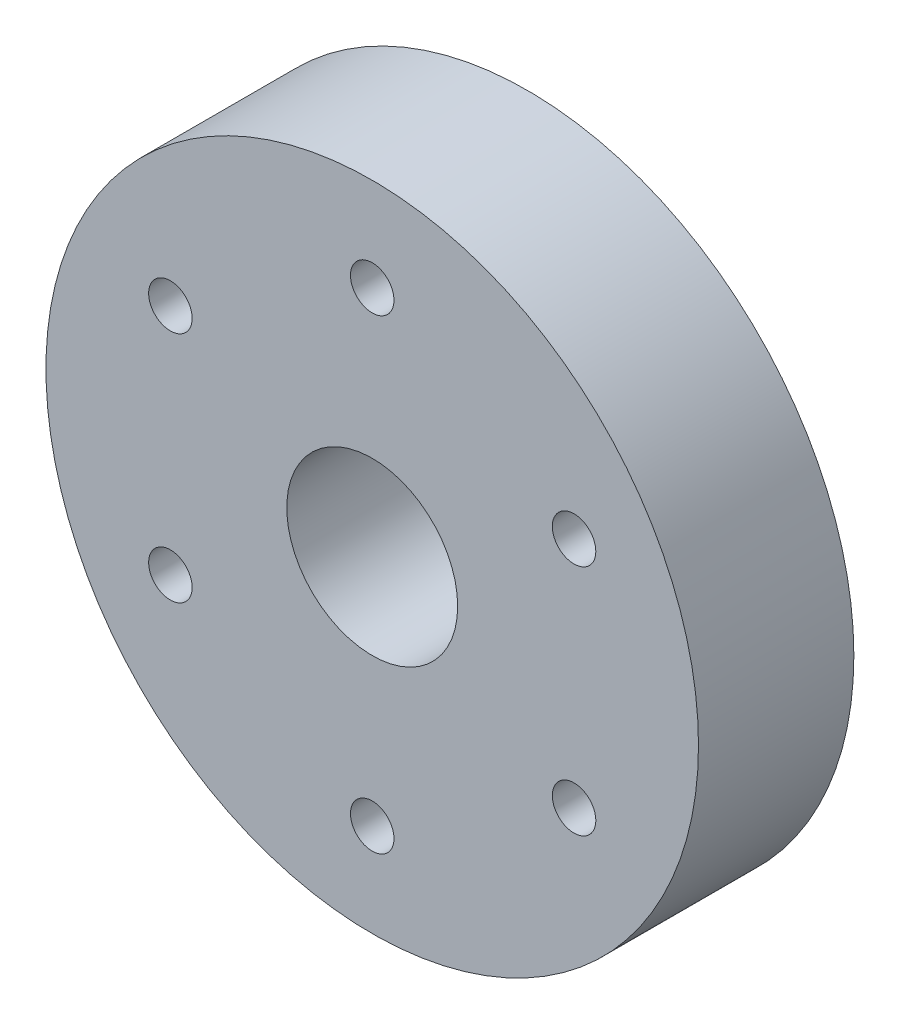
ISO-10303-21;
HEADER;
FILE_DESCRIPTION(('STEP AP214'),'2;1');
FILE_NAME('part.step','',(''),(''),'','','');
FILE_SCHEMA(('AUTOMOTIVE_DESIGN { 1 0 10303 214 1 1 1 1 }'));
ENDSEC;
DATA;
#1=APPLICATION_CONTEXT('core data for automotive mechanical design processes');
#2=APPLICATION_PROTOCOL_DEFINITION('international standard','automotive_design',2000,#1);
#3=PRODUCT_CONTEXT('',#1,'mechanical');
#4=PRODUCT('Part','Part','',(#3));
#5=PRODUCT_RELATED_PRODUCT_CATEGORY('part','',(#4));
#6=PRODUCT_DEFINITION_FORMATION('','',#4);
#7=PRODUCT_DEFINITION_CONTEXT('part definition',#1,'design');
#8=PRODUCT_DEFINITION('design','',#6,#7);
#9=PRODUCT_DEFINITION_SHAPE('','',#8);
#10=(LENGTH_UNIT() NAMED_UNIT(*) SI_UNIT(.MILLI.,.METRE.));
#11=(NAMED_UNIT(*) PLANE_ANGLE_UNIT() SI_UNIT($,.RADIAN.));
#12=(NAMED_UNIT(*) SI_UNIT($,.STERADIAN.) SOLID_ANGLE_UNIT());
#13=UNCERTAINTY_MEASURE_WITH_UNIT(LENGTH_MEASURE(1.E-05),#10,'distance_accuracy_value','');
#14=(GEOMETRIC_REPRESENTATION_CONTEXT(3) GLOBAL_UNCERTAINTY_ASSIGNED_CONTEXT((#13)) GLOBAL_UNIT_ASSIGNED_CONTEXT((#10,
#11,#12)) REPRESENTATION_CONTEXT('',''));
#15=CARTESIAN_POINT('',(0.,0.,0.));
#16=DIRECTION('',(0.,0.,1.));
#17=DIRECTION('',(1.,0.,0.));
#18=AXIS2_PLACEMENT_3D('',#15,#16,#17);
#19=CARTESIAN_POINT('',(0.,0.,10.));
#20=DIRECTION('',(0.,0.,-1.));
#21=DIRECTION('',(-1.,0.,0.));
#22=AXIS2_PLACEMENT_3D('',#19,#20,#21);
#23=CYLINDRICAL_SURFACE('',#22,21.);
#24=CARTESIAN_POINT('',(0.,0.,10.));
#25=DIRECTION('',(0.,0.,1.));
#26=DIRECTION('',(1.,0.,0.));
#27=AXIS2_PLACEMENT_3D('',#24,#25,#26);
#28=CIRCLE('',#27,21.);
#29=CARTESIAN_POINT('',(21.,0.,10.));
#30=VERTEX_POINT('',#29);
#31=EDGE_CURVE('E10',#30,#30,#28,.T.);
#32=ORIENTED_EDGE('',*,*,#31,.F.);
#33=EDGE_LOOP('',(#32));
#34=FACE_BOUND('',#33,.T.);
#35=CARTESIAN_POINT('',(0.,0.,0.));
#36=DIRECTION('',(0.,0.,1.));
#37=DIRECTION('',(1.,0.,0.));
#38=AXIS2_PLACEMENT_3D('',#35,#36,#37);
#39=CIRCLE('',#38,21.);
#40=CARTESIAN_POINT('',(21.,0.,0.));
#41=VERTEX_POINT('',#40);
#42=EDGE_CURVE('E34',#41,#41,#39,.T.);
#43=ORIENTED_EDGE('',*,*,#42,.T.);
#44=EDGE_LOOP('',(#43));
#45=FACE_BOUND('',#44,.T.);
#46=ADVANCED_FACE('F31',(#34,#45),#23,.T.);
#47=CARTESIAN_POINT('',(0.,0.,10.));
#48=DIRECTION('',(0.,0.,1.));
#49=DIRECTION('',(1.,0.,0.));
#50=AXIS2_PLACEMENT_3D('',#47,#48,#49);
#51=PLANE('',#50);
#52=CARTESIAN_POINT('',(0.,0.,10.));
#53=DIRECTION('',(0.,0.,1.));
#54=DIRECTION('',(1.,0.,0.));
#55=AXIS2_PLACEMENT_3D('',#52,#53,#54);
#56=CIRCLE('',#55,5.5);
#57=CARTESIAN_POINT('',(5.5,0.,10.));
#58=VERTEX_POINT('',#57);
#59=EDGE_CURVE('E79',#58,#58,#56,.T.);
#60=ORIENTED_EDGE('',*,*,#59,.F.);
#61=EDGE_LOOP('',(#60));
#62=FACE_BOUND('',#61,.T.);
#63=CARTESIAN_POINT('',(0.,15.,10.));
#64=DIRECTION('',(0.,0.,1.));
#65=DIRECTION('',(0.499999999999998,0.86602540378444,0.));
#66=AXIS2_PLACEMENT_3D('',#63,#64,#65);
#67=CIRCLE('',#66,1.4);
#68=CARTESIAN_POINT('',(0.699999999999939,16.2124355652982,10.));
#69=VERTEX_POINT('',#68);
#70=EDGE_CURVE('E74',#69,#69,#67,.T.);
#71=ORIENTED_EDGE('',*,*,#70,.F.);
#72=EDGE_LOOP('',(#71));
#73=FACE_BOUND('',#72,.T.);
#74=CARTESIAN_POINT('',(-12.9903810567666,7.49999999999992,10.));
#75=DIRECTION('',(0.,0.,1.));
#76=DIRECTION('',(-0.500000000000004,0.866025403784436,0.));
#77=AXIS2_PLACEMENT_3D('',#74,#75,#76);
#78=CIRCLE('',#77,1.4);
#79=CARTESIAN_POINT('',(-13.6903810567666,8.71243556529813,10.));
#80=VERTEX_POINT('',#79);
#81=EDGE_CURVE('E68',#80,#80,#78,.T.);
#82=ORIENTED_EDGE('',*,*,#81,.F.);
#83=EDGE_LOOP('',(#82));
#84=FACE_BOUND('',#83,.T.);
#85=CARTESIAN_POINT('',(-12.9903810567666,-7.50000000000002,10.));
#86=DIRECTION('',(0.,0.,1.));
#87=DIRECTION('',(-1.,0.,0.));
#88=AXIS2_PLACEMENT_3D('',#85,#86,#87);
#89=CIRCLE('',#88,1.4);
#90=CARTESIAN_POINT('',(-14.3903810567666,-7.50000000000002,10.));
#91=VERTEX_POINT('',#90);
#92=EDGE_CURVE('E62',#91,#91,#89,.T.);
#93=ORIENTED_EDGE('',*,*,#92,.F.);
#94=EDGE_LOOP('',(#93));
#95=FACE_BOUND('',#94,.T.);
#96=CARTESIAN_POINT('',(1.62196645003831E-13,-15.,10.));
#97=DIRECTION('',(0.,0.,1.));
#98=DIRECTION('',(-0.499999999999992,-0.866025403784443,0.));
#99=AXIS2_PLACEMENT_3D('',#96,#97,#98);
#100=CIRCLE('',#99,1.4);
#101=CARTESIAN_POINT('',(-0.699999999999827,-16.2124355652982,10.));
#102=VERTEX_POINT('',#101);
#103=EDGE_CURVE('E56',#102,#102,#100,.T.);
#104=ORIENTED_EDGE('',*,*,#103,.F.);
#105=EDGE_LOOP('',(#104));
#106=FACE_BOUND('',#105,.T.);
#107=CARTESIAN_POINT('',(12.9903810567667,-7.49999999999983,10.));
#108=DIRECTION('',(0.,0.,1.));
#109=DIRECTION('',(0.50000000000001,-0.866025403784433,0.));
#110=AXIS2_PLACEMENT_3D('',#107,#108,#109);
#111=CIRCLE('',#110,1.4);
#112=CARTESIAN_POINT('',(13.6903810567667,-8.71243556529804,10.));
#113=VERTEX_POINT('',#112);
#114=EDGE_CURVE('E49',#113,#113,#111,.T.);
#115=ORIENTED_EDGE('',*,*,#114,.F.);
#116=EDGE_LOOP('',(#115));
#117=FACE_BOUND('',#116,.T.);
#118=CARTESIAN_POINT('',(12.9903810567666,7.50000000000002,10.));
#119=DIRECTION('',(0.,0.,1.));
#120=DIRECTION('',(1.,0.,0.));
#121=AXIS2_PLACEMENT_3D('',#118,#119,#120);
#122=CIRCLE('',#121,1.4);
#123=CARTESIAN_POINT('',(14.3903810567666,7.50000000000002,10.));
#124=VERTEX_POINT('',#123);
#125=EDGE_CURVE('E43',#124,#124,#122,.T.);
#126=ORIENTED_EDGE('',*,*,#125,.F.);
#127=EDGE_LOOP('',(#126));
#128=FACE_BOUND('',#127,.T.);
#129=ORIENTED_EDGE('',*,*,#31,.T.);
#130=EDGE_LOOP('',(#129));
#131=FACE_BOUND('',#130,.T.);
#132=ADVANCED_FACE('F95',(#62,#73,#84,#95,#106,#117,#128,#131),#51,.T.);
#133=CARTESIAN_POINT('',(0.,0.,0.));
#134=DIRECTION('',(0.,0.,1.));
#135=DIRECTION('',(1.,0.,0.));
#136=AXIS2_PLACEMENT_3D('',#133,#134,#135);
#137=PLANE('',#136);
#138=CARTESIAN_POINT('',(0.,0.,0.));
#139=DIRECTION('',(0.,0.,1.));
#140=DIRECTION('',(1.,0.,0.));
#141=AXIS2_PLACEMENT_3D('',#138,#139,#140);
#142=CIRCLE('',#141,5.5);
#143=CARTESIAN_POINT('',(5.5,0.,0.));
#144=VERTEX_POINT('',#143);
#145=EDGE_CURVE('E53',#144,#144,#142,.T.);
#146=ORIENTED_EDGE('',*,*,#145,.T.);
#147=EDGE_LOOP('',(#146));
#148=FACE_BOUND('',#147,.T.);
#149=CARTESIAN_POINT('',(0.,15.,0.));
#150=DIRECTION('',(0.,0.,1.));
#151=DIRECTION('',(0.499999999999998,0.86602540378444,0.));
#152=AXIS2_PLACEMENT_3D('',#149,#150,#151);
#153=CIRCLE('',#152,1.4);
#154=CARTESIAN_POINT('',(0.699999999999939,16.2124355652982,0.));
#155=VERTEX_POINT('',#154);
#156=EDGE_CURVE('E46',#155,#155,#153,.T.);
#157=ORIENTED_EDGE('',*,*,#156,.T.);
#158=EDGE_LOOP('',(#157));
#159=FACE_BOUND('',#158,.T.);
#160=CARTESIAN_POINT('',(-12.9903810567666,7.49999999999992,0.));
#161=DIRECTION('',(0.,0.,1.));
#162=DIRECTION('',(-0.500000000000004,0.866025403784436,0.));
#163=AXIS2_PLACEMENT_3D('',#160,#161,#162);
#164=CIRCLE('',#163,1.4);
#165=CARTESIAN_POINT('',(-13.6903810567666,8.71243556529813,0.));
#166=VERTEX_POINT('',#165);
#167=EDGE_CURVE('E71',#166,#166,#164,.T.);
#168=ORIENTED_EDGE('',*,*,#167,.T.);
#169=EDGE_LOOP('',(#168));
#170=FACE_BOUND('',#169,.T.);
#171=CARTESIAN_POINT('',(-12.9903810567666,-7.50000000000002,0.));
#172=DIRECTION('',(0.,0.,1.));
#173=DIRECTION('',(-1.,0.,0.));
#174=AXIS2_PLACEMENT_3D('',#171,#172,#173);
#175=CIRCLE('',#174,1.4);
#176=CARTESIAN_POINT('',(-14.3903810567666,-7.50000000000002,0.));
#177=VERTEX_POINT('',#176);
#178=EDGE_CURVE('E65',#177,#177,#175,.T.);
#179=ORIENTED_EDGE('',*,*,#178,.T.);
#180=EDGE_LOOP('',(#179));
#181=FACE_BOUND('',#180,.T.);
#182=CARTESIAN_POINT('',(1.62196645003831E-13,-15.,0.));
#183=DIRECTION('',(0.,0.,1.));
#184=DIRECTION('',(-0.499999999999992,-0.866025403784443,0.));
#185=AXIS2_PLACEMENT_3D('',#182,#183,#184);
#186=CIRCLE('',#185,1.4);
#187=CARTESIAN_POINT('',(-0.699999999999827,-16.2124355652982,0.));
#188=VERTEX_POINT('',#187);
#189=EDGE_CURVE('E59',#188,#188,#186,.T.);
#190=ORIENTED_EDGE('',*,*,#189,.T.);
#191=EDGE_LOOP('',(#190));
#192=FACE_BOUND('',#191,.T.);
#193=CARTESIAN_POINT('',(12.9903810567667,-7.49999999999983,0.));
#194=DIRECTION('',(0.,0.,1.));
#195=DIRECTION('',(0.50000000000001,-0.866025403784433,0.));
#196=AXIS2_PLACEMENT_3D('',#193,#194,#195);
#197=CIRCLE('',#196,1.4);
#198=CARTESIAN_POINT('',(13.6903810567667,-8.71243556529804,0.));
#199=VERTEX_POINT('',#198);
#200=EDGE_CURVE('E52',#199,#199,#197,.T.);
#201=ORIENTED_EDGE('',*,*,#200,.T.);
#202=EDGE_LOOP('',(#201));
#203=FACE_BOUND('',#202,.T.);
#204=CARTESIAN_POINT('',(12.9903810567666,7.50000000000002,0.));
#205=DIRECTION('',(0.,0.,1.));
#206=DIRECTION('',(1.,0.,0.));
#207=AXIS2_PLACEMENT_3D('',#204,#205,#206);
#208=CIRCLE('',#207,1.4);
#209=CARTESIAN_POINT('',(14.3903810567666,7.50000000000002,0.));
#210=VERTEX_POINT('',#209);
#211=EDGE_CURVE('E41',#210,#210,#208,.T.);
#212=ORIENTED_EDGE('',*,*,#211,.T.);
#213=EDGE_LOOP('',(#212));
#214=FACE_BOUND('',#213,.T.);
#215=ORIENTED_EDGE('',*,*,#42,.F.);
#216=EDGE_LOOP('',(#215));
#217=FACE_BOUND('',#216,.T.);
#218=ADVANCED_FACE('F85',(#148,#159,#170,#181,#192,#203,#214,#217),#137,.F.);
#219=CARTESIAN_POINT('',(12.9903810567666,7.50000000000002,0.));
#220=DIRECTION('',(0.,0.,1.));
#221=DIRECTION('',(1.,0.,0.));
#222=AXIS2_PLACEMENT_3D('',#219,#220,#221);
#223=CYLINDRICAL_SURFACE('',#222,1.4);
#224=ORIENTED_EDGE('',*,*,#211,.F.);
#225=EDGE_LOOP('',(#224));
#226=FACE_BOUND('',#225,.T.);
#227=ORIENTED_EDGE('',*,*,#125,.T.);
#228=EDGE_LOOP('',(#227));
#229=FACE_BOUND('',#228,.T.);
#230=ADVANCED_FACE('F111',(#226,#229),#223,.F.);
#231=CARTESIAN_POINT('',(12.9903810567667,-7.49999999999983,0.));
#232=DIRECTION('',(0.,0.,1.));
#233=DIRECTION('',(1.,0.,0.));
#234=AXIS2_PLACEMENT_3D('',#231,#232,#233);
#235=CYLINDRICAL_SURFACE('',#234,1.4);
#236=ORIENTED_EDGE('',*,*,#200,.F.);
#237=EDGE_LOOP('',(#236));
#238=FACE_BOUND('',#237,.T.);
#239=ORIENTED_EDGE('',*,*,#114,.T.);
#240=EDGE_LOOP('',(#239));
#241=FACE_BOUND('',#240,.T.);
#242=ADVANCED_FACE('F113',(#238,#241),#235,.F.);
#243=CARTESIAN_POINT('',(1.62196645003831E-13,-15.,0.));
#244=DIRECTION('',(0.,0.,1.));
#245=DIRECTION('',(1.,0.,0.));
#246=AXIS2_PLACEMENT_3D('',#243,#244,#245);
#247=CYLINDRICAL_SURFACE('',#246,1.4);
#248=ORIENTED_EDGE('',*,*,#189,.F.);
#249=EDGE_LOOP('',(#248));
#250=FACE_BOUND('',#249,.T.);
#251=ORIENTED_EDGE('',*,*,#103,.T.);
#252=EDGE_LOOP('',(#251));
#253=FACE_BOUND('',#252,.T.);
#254=ADVANCED_FACE('F120',(#250,#253),#247,.F.);
#255=CARTESIAN_POINT('',(-12.9903810567666,-7.50000000000002,0.));
#256=DIRECTION('',(0.,0.,1.));
#257=DIRECTION('',(1.,0.,0.));
#258=AXIS2_PLACEMENT_3D('',#255,#256,#257);
#259=CYLINDRICAL_SURFACE('',#258,1.4);
#260=ORIENTED_EDGE('',*,*,#178,.F.);
#261=EDGE_LOOP('',(#260));
#262=FACE_BOUND('',#261,.T.);
#263=ORIENTED_EDGE('',*,*,#92,.T.);
#264=EDGE_LOOP('',(#263));
#265=FACE_BOUND('',#264,.T.);
#266=ADVANCED_FACE('F162',(#262,#265),#259,.F.);
#267=CARTESIAN_POINT('',(-12.9903810567666,7.49999999999992,0.));
#268=DIRECTION('',(0.,0.,1.));
#269=DIRECTION('',(1.,0.,0.));
#270=AXIS2_PLACEMENT_3D('',#267,#268,#269);
#271=CYLINDRICAL_SURFACE('',#270,1.4);
#272=ORIENTED_EDGE('',*,*,#167,.F.);
#273=EDGE_LOOP('',(#272));
#274=FACE_BOUND('',#273,.T.);
#275=ORIENTED_EDGE('',*,*,#81,.T.);
#276=EDGE_LOOP('',(#275));
#277=FACE_BOUND('',#276,.T.);
#278=ADVANCED_FACE('F155',(#274,#277),#271,.F.);
#279=CARTESIAN_POINT('',(0.,15.,0.));
#280=DIRECTION('',(0.,0.,1.));
#281=DIRECTION('',(1.,0.,0.));
#282=AXIS2_PLACEMENT_3D('',#279,#280,#281);
#283=CYLINDRICAL_SURFACE('',#282,1.4);
#284=ORIENTED_EDGE('',*,*,#156,.F.);
#285=EDGE_LOOP('',(#284));
#286=FACE_BOUND('',#285,.T.);
#287=ORIENTED_EDGE('',*,*,#70,.T.);
#288=EDGE_LOOP('',(#287));
#289=FACE_BOUND('',#288,.T.);
#290=ADVANCED_FACE('F91',(#286,#289),#283,.F.);
#291=CARTESIAN_POINT('',(0.,0.,0.));
#292=DIRECTION('',(0.,0.,1.));
#293=DIRECTION('',(1.,0.,0.));
#294=AXIS2_PLACEMENT_3D('',#291,#292,#293);
#295=CYLINDRICAL_SURFACE('',#294,5.5);
#296=ORIENTED_EDGE('',*,*,#145,.F.);
#297=EDGE_LOOP('',(#296));
#298=FACE_BOUND('',#297,.T.);
#299=ORIENTED_EDGE('',*,*,#59,.T.);
#300=EDGE_LOOP('',(#299));
#301=FACE_BOUND('',#300,.T.);
#302=ADVANCED_FACE('F88',(#298,#301),#295,.F.);
#303=CLOSED_SHELL('',(#46,#132,#218,#230,#242,#254,#266,#278,#290,#302));
#304=MANIFOLD_SOLID_BREP('B2',#303);
#305=ADVANCED_BREP_SHAPE_REPRESENTATION('',(#18,#304),#14);
#306=SHAPE_DEFINITION_REPRESENTATION(#9,#305);
ENDSEC;
END-ISO-10303-21;
